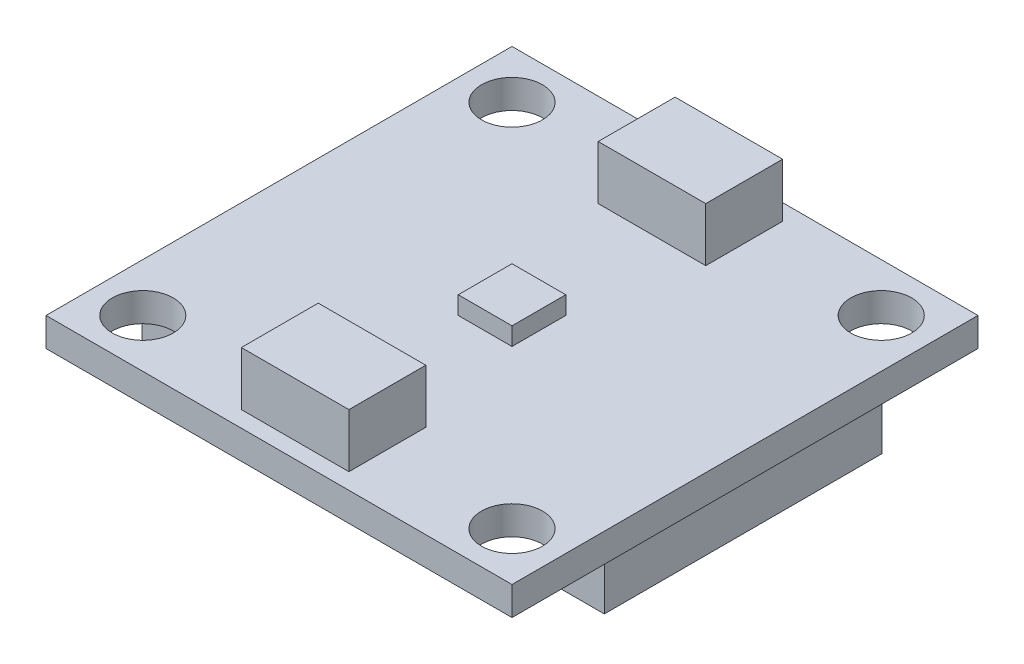
ISO-10303-21;
HEADER;
FILE_DESCRIPTION(('STEP AP214'),'2;1');
FILE_NAME('part.step','',(''),(''),'','','');
FILE_SCHEMA(('AUTOMOTIVE_DESIGN { 1 0 10303 214 1 1 1 1 }'));
ENDSEC;
DATA;
#1=APPLICATION_CONTEXT('core data for automotive mechanical design processes');
#2=APPLICATION_PROTOCOL_DEFINITION('international standard','automotive_design',2000,#1);
#3=PRODUCT_CONTEXT('',#1,'mechanical');
#4=PRODUCT('Part','Part','',(#3));
#5=PRODUCT_RELATED_PRODUCT_CATEGORY('part','',(#4));
#6=PRODUCT_DEFINITION_FORMATION('','',#4);
#7=PRODUCT_DEFINITION_CONTEXT('part definition',#1,'design');
#8=PRODUCT_DEFINITION('design','',#6,#7);
#9=PRODUCT_DEFINITION_SHAPE('','',#8);
#10=(LENGTH_UNIT() NAMED_UNIT(*) SI_UNIT(.MILLI.,.METRE.));
#11=(NAMED_UNIT(*) PLANE_ANGLE_UNIT() SI_UNIT($,.RADIAN.));
#12=(NAMED_UNIT(*) SI_UNIT($,.STERADIAN.) SOLID_ANGLE_UNIT());
#13=UNCERTAINTY_MEASURE_WITH_UNIT(LENGTH_MEASURE(1.E-05),#10,'distance_accuracy_value','');
#14=(GEOMETRIC_REPRESENTATION_CONTEXT(3) GLOBAL_UNCERTAINTY_ASSIGNED_CONTEXT((#13)) GLOBAL_UNIT_ASSIGNED_CONTEXT((#10,
#11,#12)) REPRESENTATION_CONTEXT('',''));
#15=CARTESIAN_POINT('',(0.,0.,0.));
#16=DIRECTION('',(0.,0.,1.));
#17=DIRECTION('',(1.,0.,0.));
#18=AXIS2_PLACEMENT_3D('',#15,#16,#17);
#19=CARTESIAN_POINT('',(0.,1.6,0.));
#20=DIRECTION('',(0.,1.,0.));
#21=DIRECTION('',(0.,0.,1.));
#22=AXIS2_PLACEMENT_3D('',#19,#20,#21);
#23=PLANE('',#22);
#24=CARTESIAN_POINT('',(-10.3,1.6,10.3));
#25=DIRECTION('',(0.,1.,0.));
#26=DIRECTION('',(0.,0.,1.));
#27=AXIS2_PLACEMENT_3D('',#24,#25,#26);
#28=CIRCLE('',#27,1.7);
#29=CARTESIAN_POINT('',(-10.3,1.6,12.));
#30=VERTEX_POINT('',#29);
#31=EDGE_CURVE('E352',#30,#30,#28,.T.);
#32=ORIENTED_EDGE('',*,*,#31,.F.);
#33=EDGE_LOOP('',(#32));
#34=FACE_BOUND('',#33,.T.);
#35=CARTESIAN_POINT('',(-10.3,1.6,-10.3));
#36=DIRECTION('',(0.,1.,0.));
#37=DIRECTION('',(0.,0.,1.));
#38=AXIS2_PLACEMENT_3D('',#35,#36,#37);
#39=CIRCLE('',#38,1.7);
#40=CARTESIAN_POINT('',(-10.3,1.6,-8.6));
#41=VERTEX_POINT('',#40);
#42=EDGE_CURVE('E364',#41,#41,#39,.T.);
#43=ORIENTED_EDGE('',*,*,#42,.F.);
#44=EDGE_LOOP('',(#43));
#45=FACE_BOUND('',#44,.T.);
#46=DIRECTION('',(0.,0.,-1.));
#47=VECTOR('',#46,1.);
#48=CARTESIAN_POINT('',(13.,1.6,-13.));
#49=LINE('',#48,#47);
#50=CARTESIAN_POINT('',(13.,1.6,13.));
#51=VERTEX_POINT('',#50);
#52=CARTESIAN_POINT('',(13.,1.6,-13.));
#53=VERTEX_POINT('',#52);
#54=EDGE_CURVE('E370',#51,#53,#49,.T.);
#55=ORIENTED_EDGE('',*,*,#54,.T.);
#56=DIRECTION('',(-1.,0.,0.));
#57=VECTOR('',#56,1.);
#58=CARTESIAN_POINT('',(-13.,1.6,-13.));
#59=LINE('',#58,#57);
#60=CARTESIAN_POINT('',(-13.,1.6,-13.));
#61=VERTEX_POINT('',#60);
#62=EDGE_CURVE('E373',#53,#61,#59,.T.);
#63=ORIENTED_EDGE('',*,*,#62,.T.);
#64=DIRECTION('',(0.,0.,1.));
#65=VECTOR('',#64,1.);
#66=CARTESIAN_POINT('',(-13.,1.6,-13.));
#67=LINE('',#66,#65);
#68=CARTESIAN_POINT('',(-13.,1.6,13.));
#69=VERTEX_POINT('',#68);
#70=EDGE_CURVE('E376',#61,#69,#67,.T.);
#71=ORIENTED_EDGE('',*,*,#70,.T.);
#72=DIRECTION('',(1.,0.,0.));
#73=VECTOR('',#72,1.);
#74=CARTESIAN_POINT('',(-13.,1.6,13.));
#75=LINE('',#74,#73);
#76=EDGE_CURVE('E378',#69,#51,#75,.T.);
#77=ORIENTED_EDGE('',*,*,#76,.T.);
#78=EDGE_LOOP('',(#55,#63,#71,#77));
#79=FACE_BOUND('',#78,.T.);
#80=CARTESIAN_POINT('',(10.3,1.6,-10.3));
#81=DIRECTION('',(0.,1.,0.));
#82=DIRECTION('',(0.,0.,1.));
#83=AXIS2_PLACEMENT_3D('',#80,#81,#82);
#84=CIRCLE('',#83,1.7);
#85=CARTESIAN_POINT('',(10.3,1.6,-8.6));
#86=VERTEX_POINT('',#85);
#87=EDGE_CURVE('E358',#86,#86,#84,.T.);
#88=ORIENTED_EDGE('',*,*,#87,.F.);
#89=EDGE_LOOP('',(#88));
#90=FACE_BOUND('',#89,.T.);
#91=CARTESIAN_POINT('',(10.3,1.6,10.3));
#92=DIRECTION('',(0.,1.,0.));
#93=DIRECTION('',(0.,0.,1.));
#94=AXIS2_PLACEMENT_3D('',#91,#92,#93);
#95=CIRCLE('',#94,1.7);
#96=CARTESIAN_POINT('',(10.3,1.6,12.));
#97=VERTEX_POINT('',#96);
#98=EDGE_CURVE('E346',#97,#97,#95,.T.);
#99=ORIENTED_EDGE('',*,*,#98,.F.);
#100=EDGE_LOOP('',(#99));
#101=FACE_BOUND('',#100,.T.);
#102=DIRECTION('',(1.,0.,0.));
#103=VECTOR('',#102,1.);
#104=CARTESIAN_POINT('',(-3.,1.6,-7.81));
#105=LINE('',#104,#103);
#106=CARTESIAN_POINT('',(-3.,1.6,-7.81));
#107=VERTEX_POINT('',#106);
#108=CARTESIAN_POINT('',(3.,1.6,-7.81));
#109=VERTEX_POINT('',#108);
#110=EDGE_CURVE('E330',#107,#109,#105,.T.);
#111=ORIENTED_EDGE('',*,*,#110,.F.);
#112=DIRECTION('',(0.,0.,1.));
#113=VECTOR('',#112,1.);
#114=CARTESIAN_POINT('',(-3.,1.6,-12.1));
#115=LINE('',#114,#113);
#116=CARTESIAN_POINT('',(-3.,1.6,-12.1));
#117=VERTEX_POINT('',#116);
#118=EDGE_CURVE('E316',#117,#107,#115,.T.);
#119=ORIENTED_EDGE('',*,*,#118,.F.);
#120=DIRECTION('',(-1.,0.,0.));
#121=VECTOR('',#120,1.);
#122=CARTESIAN_POINT('',(-3.,1.6,-12.1));
#123=LINE('',#122,#121);
#124=CARTESIAN_POINT('',(3.,1.6,-12.1));
#125=VERTEX_POINT('',#124);
#126=EDGE_CURVE('E321',#125,#117,#123,.T.);
#127=ORIENTED_EDGE('',*,*,#126,.F.);
#128=DIRECTION('',(0.,0.,-1.));
#129=VECTOR('',#128,1.);
#130=CARTESIAN_POINT('',(3.,1.6,-12.1));
#131=LINE('',#130,#129);
#132=EDGE_CURVE('E332',#109,#125,#131,.T.);
#133=ORIENTED_EDGE('',*,*,#132,.F.);
#134=EDGE_LOOP('',(#111,#119,#127,#133));
#135=FACE_BOUND('',#134,.T.);
#136=DIRECTION('',(1.,0.,0.));
#137=VECTOR('',#136,1.);
#138=CARTESIAN_POINT('',(-3.,1.6,12.1));
#139=LINE('',#138,#137);
#140=CARTESIAN_POINT('',(-3.,1.6,12.1));
#141=VERTEX_POINT('',#140);
#142=CARTESIAN_POINT('',(3.00000000000001,1.6,12.1));
#143=VERTEX_POINT('',#142);
#144=EDGE_CURVE('E301',#141,#143,#139,.T.);
#145=ORIENTED_EDGE('',*,*,#144,.F.);
#146=DIRECTION('',(0.,0.,1.));
#147=VECTOR('',#146,1.);
#148=CARTESIAN_POINT('',(-3.,1.6,12.1));
#149=LINE('',#148,#147);
#150=CARTESIAN_POINT('',(-3.,1.6,7.80999999999999));
#151=VERTEX_POINT('',#150);
#152=EDGE_CURVE('E287',#151,#141,#149,.T.);
#153=ORIENTED_EDGE('',*,*,#152,.F.);
#154=DIRECTION('',(-1.,0.,0.));
#155=VECTOR('',#154,1.);
#156=CARTESIAN_POINT('',(-3.,1.6,7.80999999999999));
#157=LINE('',#156,#155);
#158=CARTESIAN_POINT('',(3.,1.6,7.80999999999999));
#159=VERTEX_POINT('',#158);
#160=EDGE_CURVE('E292',#159,#151,#157,.T.);
#161=ORIENTED_EDGE('',*,*,#160,.F.);
#162=DIRECTION('',(0.,0.,-1.));
#163=VECTOR('',#162,1.);
#164=CARTESIAN_POINT('',(3.00000000000001,1.6,12.1));
#165=LINE('',#164,#163);
#166=EDGE_CURVE('E303',#143,#159,#165,.T.);
#167=ORIENTED_EDGE('',*,*,#166,.F.);
#168=EDGE_LOOP('',(#145,#153,#161,#167));
#169=FACE_BOUND('',#168,.T.);
#170=DIRECTION('',(-1.,0.,0.));
#171=VECTOR('',#170,1.);
#172=CARTESIAN_POINT('',(-1.5,1.6,-1.5));
#173=LINE('',#172,#171);
#174=CARTESIAN_POINT('',(1.5,1.6,-1.5));
#175=VERTEX_POINT('',#174);
#176=CARTESIAN_POINT('',(-1.5,1.6,-1.5));
#177=VERTEX_POINT('',#176);
#178=EDGE_CURVE('E708',#175,#177,#173,.T.);
#179=ORIENTED_EDGE('',*,*,#178,.F.);
#180=DIRECTION('',(0.,0.,-1.));
#181=VECTOR('',#180,1.);
#182=CARTESIAN_POINT('',(1.5,1.6,-1.5));
#183=LINE('',#182,#181);
#184=CARTESIAN_POINT('',(1.5,1.6,1.5));
#185=VERTEX_POINT('',#184);
#186=EDGE_CURVE('E218',#185,#175,#183,.T.);
#187=ORIENTED_EDGE('',*,*,#186,.F.);
#188=DIRECTION('',(1.,0.,0.));
#189=VECTOR('',#188,1.);
#190=CARTESIAN_POINT('',(-1.5,1.6,1.5));
#191=LINE('',#190,#189);
#192=CARTESIAN_POINT('',(-1.5,1.6,1.5));
#193=VERTEX_POINT('',#192);
#194=EDGE_CURVE('E214',#193,#185,#191,.T.);
#195=ORIENTED_EDGE('',*,*,#194,.F.);
#196=DIRECTION('',(0.,0.,1.));
#197=VECTOR('',#196,1.);
#198=CARTESIAN_POINT('',(-1.5,1.6,-1.5));
#199=LINE('',#198,#197);
#200=EDGE_CURVE('E705',#177,#193,#199,.T.);
#201=ORIENTED_EDGE('',*,*,#200,.F.);
#202=EDGE_LOOP('',(#179,#187,#195,#201));
#203=FACE_BOUND('',#202,.T.);
#204=ADVANCED_FACE('F34',(#34,#45,#79,#90,#101,#135,#169,#203),#23,.T.);
#205=CARTESIAN_POINT('',(0.,0.,0.));
#206=DIRECTION('',(0.,1.,0.));
#207=DIRECTION('',(0.,0.,1.));
#208=AXIS2_PLACEMENT_3D('',#205,#206,#207);
#209=PLANE('',#208);
#210=DIRECTION('',(0.,0.,-1.));
#211=VECTOR('',#210,1.);
#212=CARTESIAN_POINT('',(-12.9,0.,7.75));
#213=LINE('',#212,#211);
#214=CARTESIAN_POINT('',(-12.9,0.,7.75));
#215=VERTEX_POINT('',#214);
#216=CARTESIAN_POINT('',(-12.9,0.,-7.75));
#217=VERTEX_POINT('',#216);
#218=EDGE_CURVE('E254',#215,#217,#213,.T.);
#219=ORIENTED_EDGE('',*,*,#218,.F.);
#220=DIRECTION('',(-1.,0.,0.));
#221=VECTOR('',#220,1.);
#222=CARTESIAN_POINT('',(-12.9,0.,7.75));
#223=LINE('',#222,#221);
#224=CARTESIAN_POINT('',(-10.4,0.,7.75));
#225=VERTEX_POINT('',#224);
#226=EDGE_CURVE('E259',#225,#215,#223,.T.);
#227=ORIENTED_EDGE('',*,*,#226,.F.);
#228=DIRECTION('',(0.,0.,1.));
#229=VECTOR('',#228,1.);
#230=CARTESIAN_POINT('',(-10.4,0.,7.75));
#231=LINE('',#230,#229);
#232=CARTESIAN_POINT('',(-10.4,0.,-7.75));
#233=VERTEX_POINT('',#232);
#234=EDGE_CURVE('E271',#233,#225,#231,.T.);
#235=ORIENTED_EDGE('',*,*,#234,.F.);
#236=DIRECTION('',(1.,0.,0.));
#237=VECTOR('',#236,1.);
#238=CARTESIAN_POINT('',(-12.9,0.,-7.75));
#239=LINE('',#238,#237);
#240=EDGE_CURVE('E268',#217,#233,#239,.T.);
#241=ORIENTED_EDGE('',*,*,#240,.F.);
#242=EDGE_LOOP('',(#219,#227,#235,#241));
#243=FACE_BOUND('',#242,.T.);
#244=DIRECTION('',(0.,0.,-1.));
#245=VECTOR('',#244,1.);
#246=CARTESIAN_POINT('',(13.,0.,-13.));
#247=LINE('',#246,#245);
#248=CARTESIAN_POINT('',(13.,0.,13.));
#249=VERTEX_POINT('',#248);
#250=CARTESIAN_POINT('',(13.,0.,-13.));
#251=VERTEX_POINT('',#250);
#252=EDGE_CURVE('E367',#249,#251,#247,.T.);
#253=ORIENTED_EDGE('',*,*,#252,.F.);
#254=DIRECTION('',(1.,0.,0.));
#255=VECTOR('',#254,1.);
#256=CARTESIAN_POINT('',(-13.,0.,13.));
#257=LINE('',#256,#255);
#258=CARTESIAN_POINT('',(-13.,0.,13.));
#259=VERTEX_POINT('',#258);
#260=EDGE_CURVE('E374',#259,#249,#257,.T.);
#261=ORIENTED_EDGE('',*,*,#260,.F.);
#262=DIRECTION('',(0.,0.,1.));
#263=VECTOR('',#262,1.);
#264=CARTESIAN_POINT('',(-13.,0.,-13.));
#265=LINE('',#264,#263);
#266=CARTESIAN_POINT('',(-13.,0.,-13.));
#267=VERTEX_POINT('',#266);
#268=EDGE_CURVE('E385',#267,#259,#265,.T.);
#269=ORIENTED_EDGE('',*,*,#268,.F.);
#270=DIRECTION('',(-1.,0.,0.));
#271=VECTOR('',#270,1.);
#272=CARTESIAN_POINT('',(-13.,0.,-13.));
#273=LINE('',#272,#271);
#274=EDGE_CURVE('E383',#251,#267,#273,.T.);
#275=ORIENTED_EDGE('',*,*,#274,.F.);
#276=EDGE_LOOP('',(#253,#261,#269,#275));
#277=FACE_BOUND('',#276,.T.);
#278=CARTESIAN_POINT('',(-10.3,0.,-10.3));
#279=DIRECTION('',(0.,1.,0.));
#280=DIRECTION('',(0.,0.,1.));
#281=AXIS2_PLACEMENT_3D('',#278,#279,#280);
#282=CIRCLE('',#281,1.7);
#283=CARTESIAN_POINT('',(-10.3,0.,-8.6));
#284=VERTEX_POINT('',#283);
#285=EDGE_CURVE('E361',#284,#284,#282,.T.);
#286=ORIENTED_EDGE('',*,*,#285,.T.);
#287=EDGE_LOOP('',(#286));
#288=FACE_BOUND('',#287,.T.);
#289=CARTESIAN_POINT('',(10.3,0.,-10.3));
#290=DIRECTION('',(0.,1.,0.));
#291=DIRECTION('',(0.,0.,1.));
#292=AXIS2_PLACEMENT_3D('',#289,#290,#291);
#293=CIRCLE('',#292,1.7);
#294=CARTESIAN_POINT('',(10.3,0.,-8.6));
#295=VERTEX_POINT('',#294);
#296=EDGE_CURVE('E355',#295,#295,#293,.T.);
#297=ORIENTED_EDGE('',*,*,#296,.T.);
#298=EDGE_LOOP('',(#297));
#299=FACE_BOUND('',#298,.T.);
#300=CARTESIAN_POINT('',(-10.3,0.,10.3));
#301=DIRECTION('',(0.,1.,0.));
#302=DIRECTION('',(0.,0.,1.));
#303=AXIS2_PLACEMENT_3D('',#300,#301,#302);
#304=CIRCLE('',#303,1.7);
#305=CARTESIAN_POINT('',(-10.3,0.,12.));
#306=VERTEX_POINT('',#305);
#307=EDGE_CURVE('E349',#306,#306,#304,.T.);
#308=ORIENTED_EDGE('',*,*,#307,.T.);
#309=EDGE_LOOP('',(#308));
#310=FACE_BOUND('',#309,.T.);
#311=CARTESIAN_POINT('',(10.3,0.,10.3));
#312=DIRECTION('',(0.,1.,0.));
#313=DIRECTION('',(0.,0.,1.));
#314=AXIS2_PLACEMENT_3D('',#311,#312,#313);
#315=CIRCLE('',#314,1.7);
#316=CARTESIAN_POINT('',(10.3,0.,12.));
#317=VERTEX_POINT('',#316);
#318=EDGE_CURVE('E345',#317,#317,#315,.T.);
#319=ORIENTED_EDGE('',*,*,#318,.T.);
#320=EDGE_LOOP('',(#319));
#321=FACE_BOUND('',#320,.T.);
#322=DIRECTION('',(0.,0.,-1.));
#323=VECTOR('',#322,1.);
#324=CARTESIAN_POINT('',(10.4,0.,7.75));
#325=LINE('',#324,#323);
#326=CARTESIAN_POINT('',(10.4,0.,7.75));
#327=VERTEX_POINT('',#326);
#328=CARTESIAN_POINT('',(10.4,0.,-7.75));
#329=VERTEX_POINT('',#328);
#330=EDGE_CURVE('E220',#327,#329,#325,.T.);
#331=ORIENTED_EDGE('',*,*,#330,.F.);
#332=DIRECTION('',(-1.,0.,0.));
#333=VECTOR('',#332,1.);
#334=CARTESIAN_POINT('',(10.4,0.,7.75));
#335=LINE('',#334,#333);
#336=CARTESIAN_POINT('',(12.9,0.,7.75));
#337=VERTEX_POINT('',#336);
#338=EDGE_CURVE('E231',#337,#327,#335,.T.);
#339=ORIENTED_EDGE('',*,*,#338,.F.);
#340=DIRECTION('',(0.,0.,1.));
#341=VECTOR('',#340,1.);
#342=CARTESIAN_POINT('',(12.9,0.,7.75));
#343=LINE('',#342,#341);
#344=CARTESIAN_POINT('',(12.9,0.,-7.75));
#345=VERTEX_POINT('',#344);
#346=EDGE_CURVE('E239',#345,#337,#343,.T.);
#347=ORIENTED_EDGE('',*,*,#346,.F.);
#348=DIRECTION('',(1.,0.,0.));
#349=VECTOR('',#348,1.);
#350=CARTESIAN_POINT('',(10.4,0.,-7.75));
#351=LINE('',#350,#349);
#352=EDGE_CURVE('E57',#329,#345,#351,.T.);
#353=ORIENTED_EDGE('',*,*,#352,.F.);
#354=EDGE_LOOP('',(#331,#339,#347,#353));
#355=FACE_BOUND('',#354,.T.);
#356=ADVANCED_FACE('F403',(#243,#277,#288,#299,#310,#321,#355),#209,.F.);
#357=CARTESIAN_POINT('',(13.,1.6,-13.));
#358=DIRECTION('',(-1.,0.,0.));
#359=DIRECTION('',(0.,0.,1.));
#360=AXIS2_PLACEMENT_3D('',#357,#358,#359);
#361=PLANE('',#360);
#362=ORIENTED_EDGE('',*,*,#252,.T.);
#363=DIRECTION('',(0.,-1.,0.));
#364=VECTOR('',#363,1.);
#365=CARTESIAN_POINT('',(13.,1.6,-13.));
#366=LINE('',#365,#364);
#367=EDGE_CURVE('E11',#53,#251,#366,.T.);
#368=ORIENTED_EDGE('',*,*,#367,.F.);
#369=ORIENTED_EDGE('',*,*,#54,.F.);
#370=DIRECTION('',(0.,-1.,0.));
#371=VECTOR('',#370,1.);
#372=CARTESIAN_POINT('',(13.,1.6,13.));
#373=LINE('',#372,#371);
#374=EDGE_CURVE('E380',#51,#249,#373,.T.);
#375=ORIENTED_EDGE('',*,*,#374,.T.);
#376=EDGE_LOOP('',(#362,#368,#369,#375));
#377=FACE_BOUND('',#376,.T.);
#378=ADVANCED_FACE('F36',(#377),#361,.F.);
#379=CARTESIAN_POINT('',(-13.,1.6,-13.));
#380=DIRECTION('',(0.,0.,1.));
#381=DIRECTION('',(1.,0.,0.));
#382=AXIS2_PLACEMENT_3D('',#379,#380,#381);
#383=PLANE('',#382);
#384=ORIENTED_EDGE('',*,*,#274,.T.);
#385=DIRECTION('',(0.,-1.,0.));
#386=VECTOR('',#385,1.);
#387=CARTESIAN_POINT('',(-13.,1.6,-13.));
#388=LINE('',#387,#386);
#389=EDGE_CURVE('E42',#61,#267,#388,.T.);
#390=ORIENTED_EDGE('',*,*,#389,.F.);
#391=ORIENTED_EDGE('',*,*,#62,.F.);
#392=ORIENTED_EDGE('',*,*,#367,.T.);
#393=EDGE_LOOP('',(#384,#390,#391,#392));
#394=FACE_BOUND('',#393,.T.);
#395=ADVANCED_FACE('F414',(#394),#383,.F.);
#396=CARTESIAN_POINT('',(-13.,1.6,-13.));
#397=DIRECTION('',(1.,0.,0.));
#398=DIRECTION('',(0.,0.,-1.));
#399=AXIS2_PLACEMENT_3D('',#396,#397,#398);
#400=PLANE('',#399);
#401=ORIENTED_EDGE('',*,*,#268,.T.);
#402=DIRECTION('',(0.,-1.,0.));
#403=VECTOR('',#402,1.);
#404=CARTESIAN_POINT('',(-13.,1.6,13.));
#405=LINE('',#404,#403);
#406=EDGE_CURVE('E390',#69,#259,#405,.T.);
#407=ORIENTED_EDGE('',*,*,#406,.F.);
#408=ORIENTED_EDGE('',*,*,#70,.F.);
#409=ORIENTED_EDGE('',*,*,#389,.T.);
#410=EDGE_LOOP('',(#401,#407,#408,#409));
#411=FACE_BOUND('',#410,.T.);
#412=ADVANCED_FACE('F397',(#411),#400,.F.);
#413=CARTESIAN_POINT('',(-13.,1.6,13.));
#414=DIRECTION('',(0.,0.,-1.));
#415=DIRECTION('',(-1.,0.,0.));
#416=AXIS2_PLACEMENT_3D('',#413,#414,#415);
#417=PLANE('',#416);
#418=ORIENTED_EDGE('',*,*,#260,.T.);
#419=ORIENTED_EDGE('',*,*,#374,.F.);
#420=ORIENTED_EDGE('',*,*,#76,.F.);
#421=ORIENTED_EDGE('',*,*,#406,.T.);
#422=EDGE_LOOP('',(#418,#419,#420,#421));
#423=FACE_BOUND('',#422,.T.);
#424=ADVANCED_FACE('F407',(#423),#417,.F.);
#425=CARTESIAN_POINT('',(-10.3,1.6,-10.3));
#426=DIRECTION('',(0.,-1.,0.));
#427=DIRECTION('',(0.,0.,-1.));
#428=AXIS2_PLACEMENT_3D('',#425,#426,#427);
#429=CYLINDRICAL_SURFACE('',#428,1.7);
#430=ORIENTED_EDGE('',*,*,#42,.T.);
#431=EDGE_LOOP('',(#430));
#432=FACE_BOUND('',#431,.T.);
#433=ORIENTED_EDGE('',*,*,#285,.F.);
#434=EDGE_LOOP('',(#433));
#435=FACE_BOUND('',#434,.T.);
#436=ADVANCED_FACE('F432',(#432,#435),#429,.F.);
#437=CARTESIAN_POINT('',(10.3,1.6,-10.3));
#438=DIRECTION('',(0.,-1.,0.));
#439=DIRECTION('',(0.,0.,-1.));
#440=AXIS2_PLACEMENT_3D('',#437,#438,#439);
#441=CYLINDRICAL_SURFACE('',#440,1.7);
#442=ORIENTED_EDGE('',*,*,#87,.T.);
#443=EDGE_LOOP('',(#442));
#444=FACE_BOUND('',#443,.T.);
#445=ORIENTED_EDGE('',*,*,#296,.F.);
#446=EDGE_LOOP('',(#445));
#447=FACE_BOUND('',#446,.T.);
#448=ADVANCED_FACE('F439',(#444,#447),#441,.F.);
#449=CARTESIAN_POINT('',(-10.3,1.6,10.3));
#450=DIRECTION('',(0.,-1.,0.));
#451=DIRECTION('',(0.,0.,-1.));
#452=AXIS2_PLACEMENT_3D('',#449,#450,#451);
#453=CYLINDRICAL_SURFACE('',#452,1.7);
#454=ORIENTED_EDGE('',*,*,#31,.T.);
#455=EDGE_LOOP('',(#454));
#456=FACE_BOUND('',#455,.T.);
#457=ORIENTED_EDGE('',*,*,#307,.F.);
#458=EDGE_LOOP('',(#457));
#459=FACE_BOUND('',#458,.T.);
#460=ADVANCED_FACE('F444',(#456,#459),#453,.F.);
#461=CARTESIAN_POINT('',(10.3,1.6,10.3));
#462=DIRECTION('',(0.,-1.,0.));
#463=DIRECTION('',(0.,0.,-1.));
#464=AXIS2_PLACEMENT_3D('',#461,#462,#463);
#465=CYLINDRICAL_SURFACE('',#464,1.7);
#466=ORIENTED_EDGE('',*,*,#98,.T.);
#467=EDGE_LOOP('',(#466));
#468=FACE_BOUND('',#467,.T.);
#469=ORIENTED_EDGE('',*,*,#318,.F.);
#470=EDGE_LOOP('',(#469));
#471=FACE_BOUND('',#470,.T.);
#472=ADVANCED_FACE('F541',(#468,#471),#465,.F.);
#473=CARTESIAN_POINT('',(-3.,4.6,-12.1));
#474=DIRECTION('',(1.,0.,0.));
#475=DIRECTION('',(0.,0.,-1.));
#476=AXIS2_PLACEMENT_3D('',#473,#474,#475);
#477=PLANE('',#476);
#478=ORIENTED_EDGE('',*,*,#118,.T.);
#479=DIRECTION('',(0.,-1.,0.));
#480=VECTOR('',#479,1.);
#481=CARTESIAN_POINT('',(-3.,4.6,-7.81));
#482=LINE('',#481,#480);
#483=CARTESIAN_POINT('',(-3.,4.6,-7.81));
#484=VERTEX_POINT('',#483);
#485=EDGE_CURVE('E343',#484,#107,#482,.T.);
#486=ORIENTED_EDGE('',*,*,#485,.F.);
#487=DIRECTION('',(0.,0.,1.));
#488=VECTOR('',#487,1.);
#489=CARTESIAN_POINT('',(-3.,4.6,-12.1));
#490=LINE('',#489,#488);
#491=CARTESIAN_POINT('',(-3.,4.6,-12.1));
#492=VERTEX_POINT('',#491);
#493=EDGE_CURVE('E317',#492,#484,#490,.T.);
#494=ORIENTED_EDGE('',*,*,#493,.F.);
#495=DIRECTION('',(0.,-1.,0.));
#496=VECTOR('',#495,1.);
#497=CARTESIAN_POINT('',(-3.,4.6,-12.1));
#498=LINE('',#497,#496);
#499=EDGE_CURVE('E327',#492,#117,#498,.T.);
#500=ORIENTED_EDGE('',*,*,#499,.T.);
#501=EDGE_LOOP('',(#478,#486,#494,#500));
#502=FACE_BOUND('',#501,.T.);
#503=ADVANCED_FACE('F537',(#502),#477,.F.);
#504=CARTESIAN_POINT('',(-3.,4.6,-7.81));
#505=DIRECTION('',(0.,0.,-1.));
#506=DIRECTION('',(-1.,0.,0.));
#507=AXIS2_PLACEMENT_3D('',#504,#505,#506);
#508=PLANE('',#507);
#509=ORIENTED_EDGE('',*,*,#110,.T.);
#510=DIRECTION('',(0.,-1.,0.));
#511=VECTOR('',#510,1.);
#512=CARTESIAN_POINT('',(3.,4.6,-7.81));
#513=LINE('',#512,#511);
#514=CARTESIAN_POINT('',(3.,4.6,-7.81));
#515=VERTEX_POINT('',#514);
#516=EDGE_CURVE('E340',#515,#109,#513,.T.);
#517=ORIENTED_EDGE('',*,*,#516,.F.);
#518=DIRECTION('',(1.,0.,0.));
#519=VECTOR('',#518,1.);
#520=CARTESIAN_POINT('',(-3.,4.6,-7.81));
#521=LINE('',#520,#519);
#522=EDGE_CURVE('E320',#484,#515,#521,.T.);
#523=ORIENTED_EDGE('',*,*,#522,.F.);
#524=ORIENTED_EDGE('',*,*,#485,.T.);
#525=EDGE_LOOP('',(#509,#517,#523,#524));
#526=FACE_BOUND('',#525,.T.);
#527=ADVANCED_FACE('F533',(#526),#508,.F.);
#528=CARTESIAN_POINT('',(3.,4.6,-12.1));
#529=DIRECTION('',(-1.,0.,0.));
#530=DIRECTION('',(0.,0.,1.));
#531=AXIS2_PLACEMENT_3D('',#528,#529,#530);
#532=PLANE('',#531);
#533=ORIENTED_EDGE('',*,*,#132,.T.);
#534=DIRECTION('',(0.,-1.,0.));
#535=VECTOR('',#534,1.);
#536=CARTESIAN_POINT('',(3.,4.6,-12.1));
#537=LINE('',#536,#535);
#538=CARTESIAN_POINT('',(3.,4.6,-12.1));
#539=VERTEX_POINT('',#538);
#540=EDGE_CURVE('E338',#539,#125,#537,.T.);
#541=ORIENTED_EDGE('',*,*,#540,.F.);
#542=DIRECTION('',(0.,0.,-1.));
#543=VECTOR('',#542,1.);
#544=CARTESIAN_POINT('',(3.,4.6,-12.1));
#545=LINE('',#544,#543);
#546=EDGE_CURVE('E323',#515,#539,#545,.T.);
#547=ORIENTED_EDGE('',*,*,#546,.F.);
#548=ORIENTED_EDGE('',*,*,#516,.T.);
#549=EDGE_LOOP('',(#533,#541,#547,#548));
#550=FACE_BOUND('',#549,.T.);
#551=ADVANCED_FACE('F529',(#550),#532,.F.);
#552=CARTESIAN_POINT('',(-3.,4.6,-12.1));
#553=DIRECTION('',(0.,0.,1.));
#554=DIRECTION('',(1.,0.,0.));
#555=AXIS2_PLACEMENT_3D('',#552,#553,#554);
#556=PLANE('',#555);
#557=ORIENTED_EDGE('',*,*,#126,.T.);
#558=ORIENTED_EDGE('',*,*,#499,.F.);
#559=DIRECTION('',(-1.,0.,0.));
#560=VECTOR('',#559,1.);
#561=CARTESIAN_POINT('',(-3.,4.6,-12.1));
#562=LINE('',#561,#560);
#563=EDGE_CURVE('E325',#539,#492,#562,.T.);
#564=ORIENTED_EDGE('',*,*,#563,.F.);
#565=ORIENTED_EDGE('',*,*,#540,.T.);
#566=EDGE_LOOP('',(#557,#558,#564,#565));
#567=FACE_BOUND('',#566,.T.);
#568=ADVANCED_FACE('F525',(#567),#556,.F.);
#569=CARTESIAN_POINT('',(0.,4.6,0.));
#570=DIRECTION('',(0.,1.,0.));
#571=DIRECTION('',(0.,0.,1.));
#572=AXIS2_PLACEMENT_3D('',#569,#570,#571);
#573=PLANE('',#572);
#574=ORIENTED_EDGE('',*,*,#493,.T.);
#575=ORIENTED_EDGE('',*,*,#522,.T.);
#576=ORIENTED_EDGE('',*,*,#546,.T.);
#577=ORIENTED_EDGE('',*,*,#563,.T.);
#578=EDGE_LOOP('',(#574,#575,#576,#577));
#579=FACE_BOUND('',#578,.T.);
#580=ADVANCED_FACE('F521',(#579),#573,.T.);
#581=CARTESIAN_POINT('',(-3.,4.6,12.1));
#582=DIRECTION('',(1.,0.,0.));
#583=DIRECTION('',(0.,0.,-1.));
#584=AXIS2_PLACEMENT_3D('',#581,#582,#583);
#585=PLANE('',#584);
#586=ORIENTED_EDGE('',*,*,#152,.T.);
#587=DIRECTION('',(0.,-1.,0.));
#588=VECTOR('',#587,1.);
#589=CARTESIAN_POINT('',(-3.,4.6,12.1));
#590=LINE('',#589,#588);
#591=CARTESIAN_POINT('',(-3.,4.6,12.1));
#592=VERTEX_POINT('',#591);
#593=EDGE_CURVE('E314',#592,#141,#590,.T.);
#594=ORIENTED_EDGE('',*,*,#593,.F.);
#595=DIRECTION('',(0.,0.,1.));
#596=VECTOR('',#595,1.);
#597=CARTESIAN_POINT('',(-3.,4.6,12.1));
#598=LINE('',#597,#596);
#599=CARTESIAN_POINT('',(-3.,4.6,7.80999999999999));
#600=VERTEX_POINT('',#599);
#601=EDGE_CURVE('E288',#600,#592,#598,.T.);
#602=ORIENTED_EDGE('',*,*,#601,.F.);
#603=DIRECTION('',(0.,-1.,0.));
#604=VECTOR('',#603,1.);
#605=CARTESIAN_POINT('',(-3.,4.6,7.80999999999999));
#606=LINE('',#605,#604);
#607=EDGE_CURVE('E298',#600,#151,#606,.T.);
#608=ORIENTED_EDGE('',*,*,#607,.T.);
#609=EDGE_LOOP('',(#586,#594,#602,#608));
#610=FACE_BOUND('',#609,.T.);
#611=ADVANCED_FACE('F517',(#610),#585,.F.);
#612=CARTESIAN_POINT('',(-3.,4.6,12.1));
#613=DIRECTION('',(0.,0.,-1.));
#614=DIRECTION('',(-1.,0.,0.));
#615=AXIS2_PLACEMENT_3D('',#612,#613,#614);
#616=PLANE('',#615);
#617=ORIENTED_EDGE('',*,*,#144,.T.);
#618=DIRECTION('',(0.,-1.,0.));
#619=VECTOR('',#618,1.);
#620=CARTESIAN_POINT('',(3.00000000000001,4.6,12.1));
#621=LINE('',#620,#619);
#622=CARTESIAN_POINT('',(3.00000000000001,4.6,12.1));
#623=VERTEX_POINT('',#622);
#624=EDGE_CURVE('E311',#623,#143,#621,.T.);
#625=ORIENTED_EDGE('',*,*,#624,.F.);
#626=DIRECTION('',(1.,0.,0.));
#627=VECTOR('',#626,1.);
#628=CARTESIAN_POINT('',(-3.,4.6,12.1));
#629=LINE('',#628,#627);
#630=EDGE_CURVE('E291',#592,#623,#629,.T.);
#631=ORIENTED_EDGE('',*,*,#630,.F.);
#632=ORIENTED_EDGE('',*,*,#593,.T.);
#633=EDGE_LOOP('',(#617,#625,#631,#632));
#634=FACE_BOUND('',#633,.T.);
#635=ADVANCED_FACE('F513',(#634),#616,.F.);
#636=CARTESIAN_POINT('',(3.00000000000001,4.6,12.1));
#637=DIRECTION('',(-1.,0.,0.));
#638=DIRECTION('',(0.,0.,1.));
#639=AXIS2_PLACEMENT_3D('',#636,#637,#638);
#640=PLANE('',#639);
#641=ORIENTED_EDGE('',*,*,#166,.T.);
#642=DIRECTION('',(0.,-1.,0.));
#643=VECTOR('',#642,1.);
#644=CARTESIAN_POINT('',(3.,4.6,7.80999999999999));
#645=LINE('',#644,#643);
#646=CARTESIAN_POINT('',(3.,4.6,7.80999999999999));
#647=VERTEX_POINT('',#646);
#648=EDGE_CURVE('E309',#647,#159,#645,.T.);
#649=ORIENTED_EDGE('',*,*,#648,.F.);
#650=DIRECTION('',(0.,0.,-1.));
#651=VECTOR('',#650,1.);
#652=CARTESIAN_POINT('',(3.00000000000001,4.6,12.1));
#653=LINE('',#652,#651);
#654=EDGE_CURVE('E294',#623,#647,#653,.T.);
#655=ORIENTED_EDGE('',*,*,#654,.F.);
#656=ORIENTED_EDGE('',*,*,#624,.T.);
#657=EDGE_LOOP('',(#641,#649,#655,#656));
#658=FACE_BOUND('',#657,.T.);
#659=ADVANCED_FACE('F509',(#658),#640,.F.);
#660=CARTESIAN_POINT('',(-3.,4.6,7.80999999999999));
#661=DIRECTION('',(0.,0.,1.));
#662=DIRECTION('',(1.,0.,0.));
#663=AXIS2_PLACEMENT_3D('',#660,#661,#662);
#664=PLANE('',#663);
#665=ORIENTED_EDGE('',*,*,#160,.T.);
#666=ORIENTED_EDGE('',*,*,#607,.F.);
#667=DIRECTION('',(-1.,0.,0.));
#668=VECTOR('',#667,1.);
#669=CARTESIAN_POINT('',(-3.,4.6,7.80999999999999));
#670=LINE('',#669,#668);
#671=EDGE_CURVE('E296',#647,#600,#670,.T.);
#672=ORIENTED_EDGE('',*,*,#671,.F.);
#673=ORIENTED_EDGE('',*,*,#648,.T.);
#674=EDGE_LOOP('',(#665,#666,#672,#673));
#675=FACE_BOUND('',#674,.T.);
#676=ADVANCED_FACE('F505',(#675),#664,.F.);
#677=CARTESIAN_POINT('',(0.,4.6,0.));
#678=DIRECTION('',(0.,-1.,0.));
#679=DIRECTION('',(0.,0.,-1.));
#680=AXIS2_PLACEMENT_3D('',#677,#678,#679);
#681=PLANE('',#680);
#682=ORIENTED_EDGE('',*,*,#601,.T.);
#683=ORIENTED_EDGE('',*,*,#630,.T.);
#684=ORIENTED_EDGE('',*,*,#654,.T.);
#685=ORIENTED_EDGE('',*,*,#671,.T.);
#686=EDGE_LOOP('',(#682,#683,#684,#685));
#687=FACE_BOUND('',#686,.T.);
#688=ADVANCED_FACE('F501',(#687),#681,.F.);
#689=CARTESIAN_POINT('',(-12.9,-2.5,7.75));
#690=DIRECTION('',(1.,0.,0.));
#691=DIRECTION('',(0.,0.,-1.));
#692=AXIS2_PLACEMENT_3D('',#689,#690,#691);
#693=PLANE('',#692);
#694=ORIENTED_EDGE('',*,*,#218,.T.);
#695=DIRECTION('',(0.,1.,0.));
#696=VECTOR('',#695,1.);
#697=CARTESIAN_POINT('',(-12.9,-2.5,-7.75));
#698=LINE('',#697,#696);
#699=CARTESIAN_POINT('',(-12.9,-2.5,-7.75));
#700=VERTEX_POINT('',#699);
#701=EDGE_CURVE('E284',#700,#217,#698,.T.);
#702=ORIENTED_EDGE('',*,*,#701,.F.);
#703=DIRECTION('',(0.,0.,-1.));
#704=VECTOR('',#703,1.);
#705=CARTESIAN_POINT('',(-12.9,-2.5,7.75));
#706=LINE('',#705,#704);
#707=CARTESIAN_POINT('',(-12.9,-2.5,7.75));
#708=VERTEX_POINT('',#707);
#709=EDGE_CURVE('E255',#708,#700,#706,.T.);
#710=ORIENTED_EDGE('',*,*,#709,.F.);
#711=DIRECTION('',(0.,1.,0.));
#712=VECTOR('',#711,1.);
#713=CARTESIAN_POINT('',(-12.9,-2.5,7.75));
#714=LINE('',#713,#712);
#715=EDGE_CURVE('E265',#708,#215,#714,.T.);
#716=ORIENTED_EDGE('',*,*,#715,.T.);
#717=EDGE_LOOP('',(#694,#702,#710,#716));
#718=FACE_BOUND('',#717,.T.);
#719=ADVANCED_FACE('F497',(#718),#693,.F.);
#720=CARTESIAN_POINT('',(-12.9,-2.5,-7.75));
#721=DIRECTION('',(0.,0.,1.));
#722=DIRECTION('',(1.,0.,0.));
#723=AXIS2_PLACEMENT_3D('',#720,#721,#722);
#724=PLANE('',#723);
#725=ORIENTED_EDGE('',*,*,#240,.T.);
#726=DIRECTION('',(0.,1.,0.));
#727=VECTOR('',#726,1.);
#728=CARTESIAN_POINT('',(-10.4,-2.5,-7.75));
#729=LINE('',#728,#727);
#730=CARTESIAN_POINT('',(-10.4,-2.5,-7.75));
#731=VERTEX_POINT('',#730);
#732=EDGE_CURVE('E281',#731,#233,#729,.T.);
#733=ORIENTED_EDGE('',*,*,#732,.F.);
#734=DIRECTION('',(1.,0.,0.));
#735=VECTOR('',#734,1.);
#736=CARTESIAN_POINT('',(-12.9,-2.5,-7.75));
#737=LINE('',#736,#735);
#738=EDGE_CURVE('E258',#700,#731,#737,.T.);
#739=ORIENTED_EDGE('',*,*,#738,.F.);
#740=ORIENTED_EDGE('',*,*,#701,.T.);
#741=EDGE_LOOP('',(#725,#733,#739,#740));
#742=FACE_BOUND('',#741,.T.);
#743=ADVANCED_FACE('F493',(#742),#724,.F.);
#744=CARTESIAN_POINT('',(-10.4,-2.5,7.75));
#745=DIRECTION('',(-1.,0.,0.));
#746=DIRECTION('',(0.,0.,1.));
#747=AXIS2_PLACEMENT_3D('',#744,#745,#746);
#748=PLANE('',#747);
#749=ORIENTED_EDGE('',*,*,#234,.T.);
#750=DIRECTION('',(0.,1.,0.));
#751=VECTOR('',#750,1.);
#752=CARTESIAN_POINT('',(-10.4,-2.5,7.75));
#753=LINE('',#752,#751);
#754=CARTESIAN_POINT('',(-10.4,-2.5,7.75));
#755=VERTEX_POINT('',#754);
#756=EDGE_CURVE('E278',#755,#225,#753,.T.);
#757=ORIENTED_EDGE('',*,*,#756,.F.);
#758=DIRECTION('',(0.,0.,1.));
#759=VECTOR('',#758,1.);
#760=CARTESIAN_POINT('',(-10.4,-2.5,7.75));
#761=LINE('',#760,#759);
#762=EDGE_CURVE('E261',#731,#755,#761,.T.);
#763=ORIENTED_EDGE('',*,*,#762,.F.);
#764=ORIENTED_EDGE('',*,*,#732,.T.);
#765=EDGE_LOOP('',(#749,#757,#763,#764));
#766=FACE_BOUND('',#765,.T.);
#767=ADVANCED_FACE('F489',(#766),#748,.F.);
#768=CARTESIAN_POINT('',(-12.9,-2.5,7.75));
#769=DIRECTION('',(0.,0.,-1.));
#770=DIRECTION('',(-1.,0.,0.));
#771=AXIS2_PLACEMENT_3D('',#768,#769,#770);
#772=PLANE('',#771);
#773=ORIENTED_EDGE('',*,*,#226,.T.);
#774=ORIENTED_EDGE('',*,*,#715,.F.);
#775=DIRECTION('',(-1.,0.,0.));
#776=VECTOR('',#775,1.);
#777=CARTESIAN_POINT('',(-12.9,-2.5,7.75));
#778=LINE('',#777,#776);
#779=EDGE_CURVE('E263',#755,#708,#778,.T.);
#780=ORIENTED_EDGE('',*,*,#779,.F.);
#781=ORIENTED_EDGE('',*,*,#756,.T.);
#782=EDGE_LOOP('',(#773,#774,#780,#781));
#783=FACE_BOUND('',#782,.T.);
#784=ADVANCED_FACE('F485',(#783),#772,.F.);
#785=CARTESIAN_POINT('',(0.,-2.5,0.));
#786=DIRECTION('',(0.,-1.,0.));
#787=DIRECTION('',(0.,0.,-1.));
#788=AXIS2_PLACEMENT_3D('',#785,#786,#787);
#789=PLANE('',#788);
#790=ORIENTED_EDGE('',*,*,#709,.T.);
#791=ORIENTED_EDGE('',*,*,#738,.T.);
#792=ORIENTED_EDGE('',*,*,#762,.T.);
#793=ORIENTED_EDGE('',*,*,#779,.T.);
#794=EDGE_LOOP('',(#790,#791,#792,#793));
#795=FACE_BOUND('',#794,.T.);
#796=ADVANCED_FACE('F479',(#795),#789,.T.);
#797=CARTESIAN_POINT('',(10.4,-2.5,7.75));
#798=DIRECTION('',(1.,0.,0.));
#799=DIRECTION('',(0.,0.,-1.));
#800=AXIS2_PLACEMENT_3D('',#797,#798,#799);
#801=PLANE('',#800);
#802=ORIENTED_EDGE('',*,*,#330,.T.);
#803=DIRECTION('',(0.,1.,0.));
#804=VECTOR('',#803,1.);
#805=CARTESIAN_POINT('',(10.4,-2.5,-7.75));
#806=LINE('',#805,#804);
#807=CARTESIAN_POINT('',(10.4,-2.5,-7.75));
#808=VERTEX_POINT('',#807);
#809=EDGE_CURVE('E252',#808,#329,#806,.T.);
#810=ORIENTED_EDGE('',*,*,#809,.F.);
#811=DIRECTION('',(0.,0.,-1.));
#812=VECTOR('',#811,1.);
#813=CARTESIAN_POINT('',(10.4,-2.5,7.75));
#814=LINE('',#813,#812);
#815=CARTESIAN_POINT('',(10.4,-2.5,7.75));
#816=VERTEX_POINT('',#815);
#817=EDGE_CURVE('E227',#816,#808,#814,.T.);
#818=ORIENTED_EDGE('',*,*,#817,.F.);
#819=DIRECTION('',(0.,1.,0.));
#820=VECTOR('',#819,1.);
#821=CARTESIAN_POINT('',(10.4,-2.5,7.75));
#822=LINE('',#821,#820);
#823=EDGE_CURVE('E236',#816,#327,#822,.T.);
#824=ORIENTED_EDGE('',*,*,#823,.T.);
#825=EDGE_LOOP('',(#802,#810,#818,#824));
#826=FACE_BOUND('',#825,.T.);
#827=ADVANCED_FACE('F463',(#826),#801,.F.);
#828=CARTESIAN_POINT('',(10.4,-2.5,-7.75));
#829=DIRECTION('',(0.,0.,1.));
#830=DIRECTION('',(1.,0.,0.));
#831=AXIS2_PLACEMENT_3D('',#828,#829,#830);
#832=PLANE('',#831);
#833=ORIENTED_EDGE('',*,*,#352,.T.);
#834=DIRECTION('',(0.,1.,0.));
#835=VECTOR('',#834,1.);
#836=CARTESIAN_POINT('',(12.9,-2.5,-7.75));
#837=LINE('',#836,#835);
#838=CARTESIAN_POINT('',(12.9,-2.5,-7.75));
#839=VERTEX_POINT('',#838);
#840=EDGE_CURVE('E249',#839,#345,#837,.T.);
#841=ORIENTED_EDGE('',*,*,#840,.F.);
#842=DIRECTION('',(1.,0.,0.));
#843=VECTOR('',#842,1.);
#844=CARTESIAN_POINT('',(10.4,-2.5,-7.75));
#845=LINE('',#844,#843);
#846=EDGE_CURVE('E230',#808,#839,#845,.T.);
#847=ORIENTED_EDGE('',*,*,#846,.F.);
#848=ORIENTED_EDGE('',*,*,#809,.T.);
#849=EDGE_LOOP('',(#833,#841,#847,#848));
#850=FACE_BOUND('',#849,.T.);
#851=ADVANCED_FACE('F471',(#850),#832,.F.);
#852=CARTESIAN_POINT('',(12.9,-2.5,7.75));
#853=DIRECTION('',(-1.,0.,0.));
#854=DIRECTION('',(0.,0.,1.));
#855=AXIS2_PLACEMENT_3D('',#852,#853,#854);
#856=PLANE('',#855);
#857=ORIENTED_EDGE('',*,*,#346,.T.);
#858=DIRECTION('',(0.,1.,0.));
#859=VECTOR('',#858,1.);
#860=CARTESIAN_POINT('',(12.9,-2.5,7.75));
#861=LINE('',#860,#859);
#862=CARTESIAN_POINT('',(12.9,-2.5,7.75));
#863=VERTEX_POINT('',#862);
#864=EDGE_CURVE('E246',#863,#337,#861,.T.);
#865=ORIENTED_EDGE('',*,*,#864,.F.);
#866=DIRECTION('',(0.,0.,1.));
#867=VECTOR('',#866,1.);
#868=CARTESIAN_POINT('',(12.9,-2.5,7.75));
#869=LINE('',#868,#867);
#870=EDGE_CURVE('E233',#839,#863,#869,.T.);
#871=ORIENTED_EDGE('',*,*,#870,.F.);
#872=ORIENTED_EDGE('',*,*,#840,.T.);
#873=EDGE_LOOP('',(#857,#865,#871,#872));
#874=FACE_BOUND('',#873,.T.);
#875=ADVANCED_FACE('F469',(#874),#856,.F.);
#876=CARTESIAN_POINT('',(10.4,-2.5,7.75));
#877=DIRECTION('',(0.,0.,-1.));
#878=DIRECTION('',(-1.,0.,0.));
#879=AXIS2_PLACEMENT_3D('',#876,#877,#878);
#880=PLANE('',#879);
#881=ORIENTED_EDGE('',*,*,#338,.T.);
#882=ORIENTED_EDGE('',*,*,#823,.F.);
#883=DIRECTION('',(-1.,0.,0.));
#884=VECTOR('',#883,1.);
#885=CARTESIAN_POINT('',(10.4,-2.5,7.75));
#886=LINE('',#885,#884);
#887=EDGE_CURVE('E235',#863,#816,#886,.T.);
#888=ORIENTED_EDGE('',*,*,#887,.F.);
#889=ORIENTED_EDGE('',*,*,#864,.T.);
#890=EDGE_LOOP('',(#881,#882,#888,#889));
#891=FACE_BOUND('',#890,.T.);
#892=ADVANCED_FACE('F459',(#891),#880,.F.);
#893=CARTESIAN_POINT('',(0.,-2.5,0.));
#894=DIRECTION('',(0.,-1.,0.));
#895=DIRECTION('',(0.,0.,-1.));
#896=AXIS2_PLACEMENT_3D('',#893,#894,#895);
#897=PLANE('',#896);
#898=ORIENTED_EDGE('',*,*,#817,.T.);
#899=ORIENTED_EDGE('',*,*,#846,.T.);
#900=ORIENTED_EDGE('',*,*,#870,.T.);
#901=ORIENTED_EDGE('',*,*,#887,.T.);
#902=EDGE_LOOP('',(#898,#899,#900,#901));
#903=FACE_BOUND('',#902,.T.);
#904=ADVANCED_FACE('F465',(#903),#897,.T.);
#905=CARTESIAN_POINT('',(1.5,2.6,-1.5));
#906=DIRECTION('',(-1.,0.,0.));
#907=DIRECTION('',(0.,0.,1.));
#908=AXIS2_PLACEMENT_3D('',#905,#906,#907);
#909=PLANE('',#908);
#910=ORIENTED_EDGE('',*,*,#186,.T.);
#911=DIRECTION('',(0.,-1.,0.));
#912=VECTOR('',#911,1.);
#913=CARTESIAN_POINT('',(1.5,2.6,-1.5));
#914=LINE('',#913,#912);
#915=CARTESIAN_POINT('',(1.5,2.6,-1.5));
#916=VERTEX_POINT('',#915);
#917=EDGE_CURVE('E199',#916,#175,#914,.T.);
#918=ORIENTED_EDGE('',*,*,#917,.F.);
#919=DIRECTION('',(0.,0.,-1.));
#920=VECTOR('',#919,1.);
#921=CARTESIAN_POINT('',(1.5,2.6,-1.5));
#922=LINE('',#921,#920);
#923=CARTESIAN_POINT('',(1.5,2.6,1.5));
#924=VERTEX_POINT('',#923);
#925=EDGE_CURVE('E206',#924,#916,#922,.T.);
#926=ORIENTED_EDGE('',*,*,#925,.F.);
#927=DIRECTION('',(0.,-1.,0.));
#928=VECTOR('',#927,1.);
#929=CARTESIAN_POINT('',(1.5,2.6,1.5));
#930=LINE('',#929,#928);
#931=EDGE_CURVE('E702',#924,#185,#930,.T.);
#932=ORIENTED_EDGE('',*,*,#931,.T.);
#933=EDGE_LOOP('',(#910,#918,#926,#932));
#934=FACE_BOUND('',#933,.T.);
#935=ADVANCED_FACE('F216',(#934),#909,.F.);
#936=CARTESIAN_POINT('',(-1.5,2.6,-1.5));
#937=DIRECTION('',(0.,0.,1.));
#938=DIRECTION('',(1.,0.,0.));
#939=AXIS2_PLACEMENT_3D('',#936,#937,#938);
#940=PLANE('',#939);
#941=ORIENTED_EDGE('',*,*,#178,.T.);
#942=DIRECTION('',(0.,-1.,0.));
#943=VECTOR('',#942,1.);
#944=CARTESIAN_POINT('',(-1.5,2.6,-1.5));
#945=LINE('',#944,#943);
#946=CARTESIAN_POINT('',(-1.5,2.6,-1.5));
#947=VERTEX_POINT('',#946);
#948=EDGE_CURVE('E202',#947,#177,#945,.T.);
#949=ORIENTED_EDGE('',*,*,#948,.F.);
#950=DIRECTION('',(-1.,0.,0.));
#951=VECTOR('',#950,1.);
#952=CARTESIAN_POINT('',(-1.5,2.6,-1.5));
#953=LINE('',#952,#951);
#954=EDGE_CURVE('E195',#916,#947,#953,.T.);
#955=ORIENTED_EDGE('',*,*,#954,.F.);
#956=ORIENTED_EDGE('',*,*,#917,.T.);
#957=EDGE_LOOP('',(#941,#949,#955,#956));
#958=FACE_BOUND('',#957,.T.);
#959=ADVANCED_FACE('F197',(#958),#940,.F.);
#960=CARTESIAN_POINT('',(-1.5,2.6,-1.5));
#961=DIRECTION('',(1.,0.,0.));
#962=DIRECTION('',(0.,0.,-1.));
#963=AXIS2_PLACEMENT_3D('',#960,#961,#962);
#964=PLANE('',#963);
#965=ORIENTED_EDGE('',*,*,#200,.T.);
#966=DIRECTION('',(0.,-1.,0.));
#967=VECTOR('',#966,1.);
#968=CARTESIAN_POINT('',(-1.5,2.6,1.5));
#969=LINE('',#968,#967);
#970=CARTESIAN_POINT('',(-1.5,2.6,1.5));
#971=VERTEX_POINT('',#970);
#972=EDGE_CURVE('E49',#971,#193,#969,.T.);
#973=ORIENTED_EDGE('',*,*,#972,.F.);
#974=DIRECTION('',(0.,0.,1.));
#975=VECTOR('',#974,1.);
#976=CARTESIAN_POINT('',(-1.5,2.6,-1.5));
#977=LINE('',#976,#975);
#978=EDGE_CURVE('E205',#947,#971,#977,.T.);
#979=ORIENTED_EDGE('',*,*,#978,.F.);
#980=ORIENTED_EDGE('',*,*,#948,.T.);
#981=EDGE_LOOP('',(#965,#973,#979,#980));
#982=FACE_BOUND('',#981,.T.);
#983=ADVANCED_FACE('F671',(#982),#964,.F.);
#984=CARTESIAN_POINT('',(-1.5,2.6,1.5));
#985=DIRECTION('',(0.,0.,-1.));
#986=DIRECTION('',(-1.,0.,0.));
#987=AXIS2_PLACEMENT_3D('',#984,#985,#986);
#988=PLANE('',#987);
#989=ORIENTED_EDGE('',*,*,#194,.T.);
#990=ORIENTED_EDGE('',*,*,#931,.F.);
#991=DIRECTION('',(1.,0.,0.));
#992=VECTOR('',#991,1.);
#993=CARTESIAN_POINT('',(-1.5,2.6,1.5));
#994=LINE('',#993,#992);
#995=EDGE_CURVE('E210',#971,#924,#994,.T.);
#996=ORIENTED_EDGE('',*,*,#995,.F.);
#997=ORIENTED_EDGE('',*,*,#972,.T.);
#998=EDGE_LOOP('',(#989,#990,#996,#997));
#999=FACE_BOUND('',#998,.T.);
#1000=ADVANCED_FACE('F680',(#999),#988,.F.);
#1001=CARTESIAN_POINT('',(0.,2.6,0.));
#1002=DIRECTION('',(0.,1.,0.));
#1003=DIRECTION('',(0.,0.,1.));
#1004=AXIS2_PLACEMENT_3D('',#1001,#1002,#1003);
#1005=PLANE('',#1004);
#1006=ORIENTED_EDGE('',*,*,#925,.T.);
#1007=ORIENTED_EDGE('',*,*,#954,.T.);
#1008=ORIENTED_EDGE('',*,*,#978,.T.);
#1009=ORIENTED_EDGE('',*,*,#995,.T.);
#1010=EDGE_LOOP('',(#1006,#1007,#1008,#1009));
#1011=FACE_BOUND('',#1010,.T.);
#1012=ADVANCED_FACE('F209',(#1011),#1005,.T.);
#1013=CLOSED_SHELL('',(#204,#356,#378,#395,#412,#424,#436,#448,#460,#472,#503,#527,#551,#568,
#580,#611,#635,#659,#676,#688,#719,#743,#767,#784,#796,#827,#851,#875,#892,#904,#935,#959,#983,
#1000,#1012));
#1014=MANIFOLD_SOLID_BREP('B2',#1013);
#1015=ADVANCED_BREP_SHAPE_REPRESENTATION('',(#18,#1014),#14);
#1016=SHAPE_DEFINITION_REPRESENTATION(#9,#1015);
ENDSEC;
END-ISO-10303-21;
